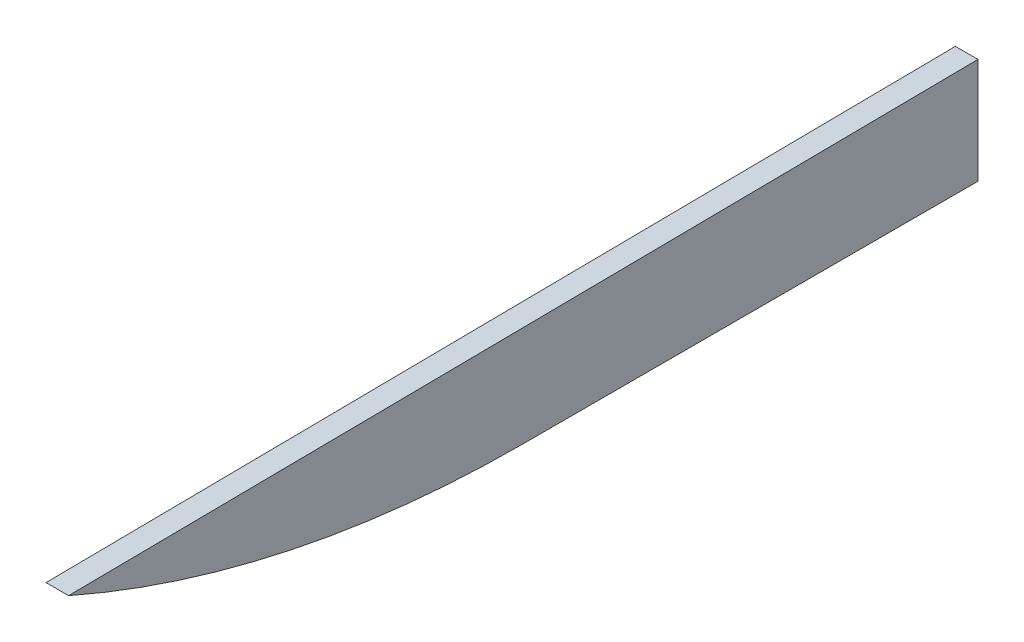
ISO-10303-21;
HEADER;
FILE_DESCRIPTION(('STEP AP214'),'2;1');
FILE_NAME('part.step','',(''),(''),'','','');
FILE_SCHEMA(('AUTOMOTIVE_DESIGN { 1 0 10303 214 1 1 1 1 }'));
ENDSEC;
DATA;
#1=APPLICATION_CONTEXT('core data for automotive mechanical design processes');
#2=APPLICATION_PROTOCOL_DEFINITION('international standard','automotive_design',2000,#1);
#3=PRODUCT_CONTEXT('',#1,'mechanical');
#4=PRODUCT('Part','Part','',(#3));
#5=PRODUCT_RELATED_PRODUCT_CATEGORY('part','',(#4));
#6=PRODUCT_DEFINITION_FORMATION('','',#4);
#7=PRODUCT_DEFINITION_CONTEXT('part definition',#1,'design');
#8=PRODUCT_DEFINITION('design','',#6,#7);
#9=PRODUCT_DEFINITION_SHAPE('','',#8);
#10=(LENGTH_UNIT() NAMED_UNIT(*) SI_UNIT(.MILLI.,.METRE.));
#11=(NAMED_UNIT(*) PLANE_ANGLE_UNIT() SI_UNIT($,.RADIAN.));
#12=(NAMED_UNIT(*) SI_UNIT($,.STERADIAN.) SOLID_ANGLE_UNIT());
#13=UNCERTAINTY_MEASURE_WITH_UNIT(LENGTH_MEASURE(1.E-05),#10,'distance_accuracy_value','');
#14=(GEOMETRIC_REPRESENTATION_CONTEXT(3) GLOBAL_UNCERTAINTY_ASSIGNED_CONTEXT((#13)) GLOBAL_UNIT_ASSIGNED_CONTEXT((#10,
#11,#12)) REPRESENTATION_CONTEXT('',''));
#15=CARTESIAN_POINT('',(0.,0.,0.));
#16=DIRECTION('',(0.,0.,1.));
#17=DIRECTION('',(1.,0.,0.));
#18=AXIS2_PLACEMENT_3D('',#15,#16,#17);
#19=CARTESIAN_POINT('',(1.5,153.152963667355,8.94693679926161));
#20=DIRECTION('',(-1.,0.,0.));
#21=DIRECTION('',(0.,0.,1.));
#22=AXIS2_PLACEMENT_3D('',#19,#20,#21);
#23=CYLINDRICAL_SURFACE('',#22,149.740214578977);
#24=CARTESIAN_POINT('',(-1.5,153.152963667355,8.94693679926161));
#25=DIRECTION('',(1.,0.,0.));
#26=DIRECTION('',(0.,0.,1.));
#27=AXIS2_PLACEMENT_3D('',#24,#25,#26);
#28=CIRCLE('',#27,149.740214578977);
#29=CARTESIAN_POINT('',(-1.5,16.1413808234101,69.3618193097396));
#30=VERTEX_POINT('',#29);
#31=CARTESIAN_POINT('',(-1.5,3.41274908837814,8.94693679926161));
#32=VERTEX_POINT('',#31);
#33=EDGE_CURVE('E107',#30,#32,#28,.T.);
#34=ORIENTED_EDGE('',*,*,#33,.T.);
#35=DIRECTION('',(-1.,0.,0.));
#36=VECTOR('',#35,1.);
#37=CARTESIAN_POINT('',(1.5,3.41274908837814,8.94693679926161));
#38=LINE('',#37,#36);
#39=CARTESIAN_POINT('',(1.5,3.41274908837814,8.94693679926161));
#40=VERTEX_POINT('',#39);
#41=EDGE_CURVE('E11',#40,#32,#38,.T.);
#42=ORIENTED_EDGE('',*,*,#41,.F.);
#43=CARTESIAN_POINT('',(1.5,153.152963667355,8.94693679926161));
#44=DIRECTION('',(1.,0.,0.));
#45=DIRECTION('',(0.,0.,1.));
#46=AXIS2_PLACEMENT_3D('',#43,#44,#45);
#47=CIRCLE('',#46,149.740214578977);
#48=CARTESIAN_POINT('',(1.5,16.1413808234101,69.3618193097396));
#49=VERTEX_POINT('',#48);
#50=EDGE_CURVE('E91',#49,#40,#47,.T.);
#51=ORIENTED_EDGE('',*,*,#50,.F.);
#52=DIRECTION('',(-1.,0.,0.));
#53=VECTOR('',#52,1.);
#54=CARTESIAN_POINT('',(1.5,16.1413808234101,69.3618193097396));
#55=LINE('',#54,#53);
#56=EDGE_CURVE('E103',#49,#30,#55,.T.);
#57=ORIENTED_EDGE('',*,*,#56,.T.);
#58=EDGE_LOOP('',(#34,#42,#51,#57));
#59=FACE_BOUND('',#58,.T.);
#60=ADVANCED_FACE('F39',(#59),#23,.T.);
#61=CARTESIAN_POINT('',(1.5,3.41274908837814,-51.4679457112164));
#62=DIRECTION('',(0.,1.,0.));
#63=DIRECTION('',(0.,0.,1.));
#64=AXIS2_PLACEMENT_3D('',#61,#62,#63);
#65=PLANE('',#64);
#66=DIRECTION('',(0.,0.,-1.));
#67=VECTOR('',#66,1.);
#68=CARTESIAN_POINT('',(-1.5,3.41274908837814,-51.4679457112164));
#69=LINE('',#68,#67);
#70=CARTESIAN_POINT('',(-1.5,3.41274908837814,-51.4679457112164));
#71=VERTEX_POINT('',#70);
#72=EDGE_CURVE('E96',#32,#71,#69,.T.);
#73=ORIENTED_EDGE('',*,*,#72,.T.);
#74=DIRECTION('',(-1.,0.,0.));
#75=VECTOR('',#74,1.);
#76=CARTESIAN_POINT('',(1.5,3.41274908837814,-51.4679457112164));
#77=LINE('',#76,#75);
#78=CARTESIAN_POINT('',(1.5,3.41274908837814,-51.4679457112164));
#79=VERTEX_POINT('',#78);
#80=EDGE_CURVE('E48',#79,#71,#77,.T.);
#81=ORIENTED_EDGE('',*,*,#80,.F.);
#82=DIRECTION('',(0.,0.,-1.));
#83=VECTOR('',#82,1.);
#84=CARTESIAN_POINT('',(1.5,3.41274908837814,-51.4679457112164));
#85=LINE('',#84,#83);
#86=EDGE_CURVE('E86',#40,#79,#85,.T.);
#87=ORIENTED_EDGE('',*,*,#86,.F.);
#88=ORIENTED_EDGE('',*,*,#41,.T.);
#89=EDGE_LOOP('',(#73,#81,#87,#88));
#90=FACE_BOUND('',#89,.T.);
#91=ADVANCED_FACE('F95',(#90),#65,.F.);
#92=CARTESIAN_POINT('',(1.5,17.432691289283,-51.4679457112164));
#93=DIRECTION('',(0.,0.,1.));
#94=DIRECTION('',(1.,0.,0.));
#95=AXIS2_PLACEMENT_3D('',#92,#93,#94);
#96=PLANE('',#95);
#97=DIRECTION('',(0.,1.,0.));
#98=VECTOR('',#97,1.);
#99=CARTESIAN_POINT('',(-1.5,17.432691289283,-51.4679457112164));
#100=LINE('',#99,#98);
#101=CARTESIAN_POINT('',(-1.5,17.432691289283,-51.4679457112164));
#102=VERTEX_POINT('',#101);
#103=EDGE_CURVE('E73',#71,#102,#100,.T.);
#104=ORIENTED_EDGE('',*,*,#103,.T.);
#105=DIRECTION('',(-1.,0.,0.));
#106=VECTOR('',#105,1.);
#107=CARTESIAN_POINT('',(1.5,17.432691289283,-51.4679457112164));
#108=LINE('',#107,#106);
#109=CARTESIAN_POINT('',(1.5,17.432691289283,-51.4679457112164));
#110=VERTEX_POINT('',#109);
#111=EDGE_CURVE('E98',#110,#102,#108,.T.);
#112=ORIENTED_EDGE('',*,*,#111,.F.);
#113=DIRECTION('',(0.,1.,0.));
#114=VECTOR('',#113,1.);
#115=CARTESIAN_POINT('',(1.5,17.432691289283,-51.4679457112164));
#116=LINE('',#115,#114);
#117=EDGE_CURVE('E89',#79,#110,#116,.T.);
#118=ORIENTED_EDGE('',*,*,#117,.F.);
#119=ORIENTED_EDGE('',*,*,#80,.T.);
#120=EDGE_LOOP('',(#104,#112,#118,#119));
#121=FACE_BOUND('',#120,.T.);
#122=ADVANCED_FACE('F99',(#121),#96,.F.);
#123=CARTESIAN_POINT('',(1.5,16.1413808234101,69.3618193097396));
#124=DIRECTION('',(0.,-0.999942898661976,-0.0106864126574563));
#125=DIRECTION('',(0.,0.0106864126574563,-0.999942898661976));
#126=AXIS2_PLACEMENT_3D('',#123,#124,#125);
#127=PLANE('',#126);
#128=DIRECTION('',(0.,-0.0106864126574563,0.999942898661976));
#129=VECTOR('',#128,1.);
#130=CARTESIAN_POINT('',(-1.5,16.1413808234101,69.3618193097396));
#131=LINE('',#130,#129);
#132=EDGE_CURVE('E79',#102,#30,#131,.T.);
#133=ORIENTED_EDGE('',*,*,#132,.T.);
#134=ORIENTED_EDGE('',*,*,#56,.F.);
#135=DIRECTION('',(0.,-0.0106864126574563,0.999942898661976));
#136=VECTOR('',#135,1.);
#137=CARTESIAN_POINT('',(1.5,16.1413808234101,69.3618193097396));
#138=LINE('',#137,#136);
#139=EDGE_CURVE('E56',#110,#49,#138,.T.);
#140=ORIENTED_EDGE('',*,*,#139,.F.);
#141=ORIENTED_EDGE('',*,*,#111,.T.);
#142=EDGE_LOOP('',(#133,#134,#140,#141));
#143=FACE_BOUND('',#142,.T.);
#144=ADVANCED_FACE('F120',(#143),#127,.F.);
#145=CARTESIAN_POINT('',(1.5,153.152963667355,8.94693679926161));
#146=DIRECTION('',(-1.,0.,0.));
#147=DIRECTION('',(0.,0.,1.));
#148=AXIS2_PLACEMENT_3D('',#145,#146,#147);
#149=PLANE('',#148);
#150=ORIENTED_EDGE('',*,*,#50,.T.);
#151=ORIENTED_EDGE('',*,*,#86,.T.);
#152=ORIENTED_EDGE('',*,*,#117,.T.);
#153=ORIENTED_EDGE('',*,*,#139,.T.);
#154=EDGE_LOOP('',(#150,#151,#152,#153));
#155=FACE_BOUND('',#154,.T.);
#156=ADVANCED_FACE('F87',(#155),#149,.F.);
#157=CARTESIAN_POINT('',(-1.5,153.152963667355,8.94693679926161));
#158=DIRECTION('',(-1.,0.,0.));
#159=DIRECTION('',(0.,0.,1.));
#160=AXIS2_PLACEMENT_3D('',#157,#158,#159);
#161=PLANE('',#160);
#162=ORIENTED_EDGE('',*,*,#33,.F.);
#163=ORIENTED_EDGE('',*,*,#132,.F.);
#164=ORIENTED_EDGE('',*,*,#103,.F.);
#165=ORIENTED_EDGE('',*,*,#72,.F.);
#166=EDGE_LOOP('',(#162,#163,#164,#165));
#167=FACE_BOUND('',#166,.T.);
#168=ADVANCED_FACE('F123',(#167),#161,.T.);
#169=CLOSED_SHELL('',(#60,#91,#122,#144,#156,#168));
#170=MANIFOLD_SOLID_BREP('B2',#169);
#171=ADVANCED_BREP_SHAPE_REPRESENTATION('',(#18,#170),#14);
#172=SHAPE_DEFINITION_REPRESENTATION(#9,#171);
ENDSEC;
END-ISO-10303-21;
